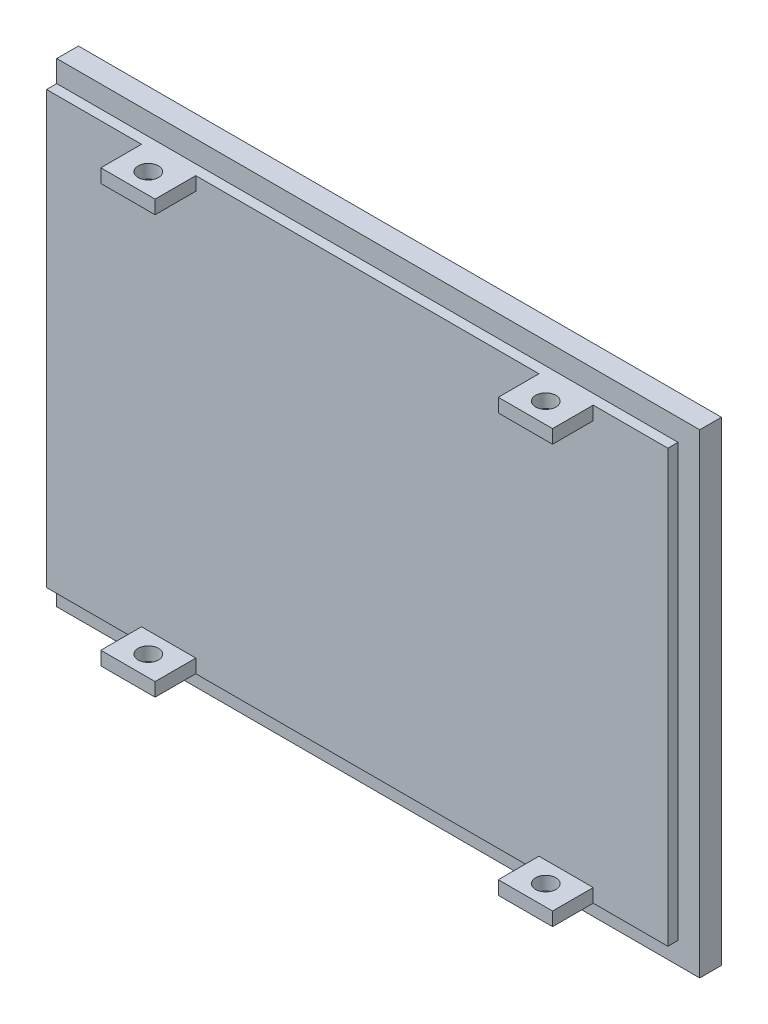
ISO-10303-21;
HEADER;
FILE_DESCRIPTION(('STEP AP214'),'2;1');
FILE_NAME('part.step','',(''),(''),'','','');
FILE_SCHEMA(('AUTOMOTIVE_DESIGN { 1 0 10303 214 1 1 1 1 }'));
ENDSEC;
DATA;
#1=APPLICATION_CONTEXT('core data for automotive mechanical design processes');
#2=APPLICATION_PROTOCOL_DEFINITION('international standard','automotive_design',2000,#1);
#3=PRODUCT_CONTEXT('',#1,'mechanical');
#4=PRODUCT('Part','Part','',(#3));
#5=PRODUCT_RELATED_PRODUCT_CATEGORY('part','',(#4));
#6=PRODUCT_DEFINITION_FORMATION('','',#4);
#7=PRODUCT_DEFINITION_CONTEXT('part definition',#1,'design');
#8=PRODUCT_DEFINITION('design','',#6,#7);
#9=PRODUCT_DEFINITION_SHAPE('','',#8);
#10=(LENGTH_UNIT() NAMED_UNIT(*) SI_UNIT(.MILLI.,.METRE.));
#11=(NAMED_UNIT(*) PLANE_ANGLE_UNIT() SI_UNIT($,.RADIAN.));
#12=(NAMED_UNIT(*) SI_UNIT($,.STERADIAN.) SOLID_ANGLE_UNIT());
#13=UNCERTAINTY_MEASURE_WITH_UNIT(LENGTH_MEASURE(1.E-05),#10,'distance_accuracy_value','');
#14=(GEOMETRIC_REPRESENTATION_CONTEXT(3) GLOBAL_UNCERTAINTY_ASSIGNED_CONTEXT((#13)) GLOBAL_UNIT_ASSIGNED_CONTEXT((#10,
#11,#12)) REPRESENTATION_CONTEXT('',''));
#15=CARTESIAN_POINT('',(0.,0.,0.));
#16=DIRECTION('',(0.,0.,1.));
#17=DIRECTION('',(1.,0.,0.));
#18=AXIS2_PLACEMENT_3D('',#15,#16,#17);
#19=CARTESIAN_POINT('',(0.,0.,3.2));
#20=DIRECTION('',(0.,0.,1.));
#21=DIRECTION('',(1.,0.,0.));
#22=AXIS2_PLACEMENT_3D('',#19,#20,#21);
#23=PLANE('',#22);
#24=DIRECTION('',(0.,-1.,0.));
#25=VECTOR('',#24,1.);
#26=CARTESIAN_POINT('',(-47.3,35.,3.2));
#27=LINE('',#26,#25);
#28=CARTESIAN_POINT('',(-47.3,35.,3.2));
#29=VERTEX_POINT('',#28);
#30=CARTESIAN_POINT('',(-47.3,31.8,3.2));
#31=VERTEX_POINT('',#30);
#32=EDGE_CURVE('E386',#29,#31,#27,.T.);
#33=ORIENTED_EDGE('',*,*,#32,.T.);
#34=DIRECTION('',(-1.,0.,0.));
#35=VECTOR('',#34,1.);
#36=CARTESIAN_POINT('',(44.3,31.8,3.2));
#37=LINE('',#36,#35);
#38=CARTESIAN_POINT('',(44.3,31.8,3.2));
#39=VERTEX_POINT('',#38);
#40=EDGE_CURVE('E66',#39,#31,#37,.T.);
#41=ORIENTED_EDGE('',*,*,#40,.F.);
#42=DIRECTION('',(0.,1.,0.));
#43=VECTOR('',#42,1.);
#44=CARTESIAN_POINT('',(44.3,-31.8,3.2));
#45=LINE('',#44,#43);
#46=CARTESIAN_POINT('',(44.3,-31.8,3.2));
#47=VERTEX_POINT('',#46);
#48=EDGE_CURVE('E370',#47,#39,#45,.T.);
#49=ORIENTED_EDGE('',*,*,#48,.F.);
#50=DIRECTION('',(1.,0.,0.));
#51=VECTOR('',#50,1.);
#52=CARTESIAN_POINT('',(44.3,-31.8,3.2));
#53=LINE('',#52,#51);
#54=CARTESIAN_POINT('',(-47.3,-31.8,3.2));
#55=VERTEX_POINT('',#54);
#56=EDGE_CURVE('E58',#55,#47,#53,.T.);
#57=ORIENTED_EDGE('',*,*,#56,.F.);
#58=CARTESIAN_POINT('',(-47.3,-35.,3.2));
#59=VERTEX_POINT('',#58);
#60=EDGE_CURVE('E385',#55,#59,#27,.T.);
#61=ORIENTED_EDGE('',*,*,#60,.T.);
#62=DIRECTION('',(1.,0.,0.));
#63=VECTOR('',#62,1.);
#64=CARTESIAN_POINT('',(-47.3,-35.,3.2));
#65=LINE('',#64,#63);
#66=CARTESIAN_POINT('',(47.5,-35.,3.2));
#67=VERTEX_POINT('',#66);
#68=EDGE_CURVE('E388',#59,#67,#65,.T.);
#69=ORIENTED_EDGE('',*,*,#68,.T.);
#70=DIRECTION('',(0.,1.,0.));
#71=VECTOR('',#70,1.);
#72=CARTESIAN_POINT('',(47.5,35.,3.2));
#73=LINE('',#72,#71);
#74=CARTESIAN_POINT('',(47.5,35.,3.2));
#75=VERTEX_POINT('',#74);
#76=EDGE_CURVE('E379',#67,#75,#73,.T.);
#77=ORIENTED_EDGE('',*,*,#76,.T.);
#78=DIRECTION('',(-1.,0.,0.));
#79=VECTOR('',#78,1.);
#80=CARTESIAN_POINT('',(-47.3,35.,3.2));
#81=LINE('',#80,#79);
#82=EDGE_CURVE('E382',#75,#29,#81,.T.);
#83=ORIENTED_EDGE('',*,*,#82,.T.);
#84=EDGE_LOOP('',(#33,#41,#49,#57,#61,#69,#77,#83));
#85=FACE_BOUND('',#84,.T.);
#86=ADVANCED_FACE('F41',(#85),#23,.T.);
#87=CARTESIAN_POINT('',(0.,0.,4.7));
#88=DIRECTION('',(0.,0.,1.));
#89=DIRECTION('',(1.,0.,0.));
#90=AXIS2_PLACEMENT_3D('',#87,#88,#89);
#91=PLANE('',#90);
#92=DIRECTION('',(1.,0.,0.));
#93=VECTOR('',#92,1.);
#94=CARTESIAN_POINT('',(-33.3,29.8,4.7));
#95=LINE('',#94,#93);
#96=CARTESIAN_POINT('',(-33.3,29.8,4.7));
#97=VERTEX_POINT('',#96);
#98=CARTESIAN_POINT('',(-25.3,29.8,4.7));
#99=VERTEX_POINT('',#98);
#100=EDGE_CURVE('E264',#97,#99,#95,.T.);
#101=ORIENTED_EDGE('',*,*,#100,.F.);
#102=DIRECTION('',(0.,-1.,0.));
#103=VECTOR('',#102,1.);
#104=CARTESIAN_POINT('',(-33.3,29.8,4.7));
#105=LINE('',#104,#103);
#106=CARTESIAN_POINT('',(-33.3,31.8,4.7));
#107=VERTEX_POINT('',#106);
#108=EDGE_CURVE('E211',#107,#97,#105,.T.);
#109=ORIENTED_EDGE('',*,*,#108,.F.);
#110=DIRECTION('',(-1.,0.,0.));
#111=VECTOR('',#110,1.);
#112=CARTESIAN_POINT('',(44.3,31.8,4.7));
#113=LINE('',#112,#111);
#114=CARTESIAN_POINT('',(-47.3,31.8,4.7));
#115=VERTEX_POINT('',#114);
#116=EDGE_CURVE('E205',#107,#115,#113,.T.);
#117=ORIENTED_EDGE('',*,*,#116,.T.);
#118=DIRECTION('',(0.,-1.,0.));
#119=VECTOR('',#118,1.);
#120=CARTESIAN_POINT('',(-47.3,-31.8,4.7));
#121=LINE('',#120,#119);
#122=CARTESIAN_POINT('',(-47.3,-31.8,4.7));
#123=VERTEX_POINT('',#122);
#124=EDGE_CURVE('E208',#115,#123,#121,.T.);
#125=ORIENTED_EDGE('',*,*,#124,.T.);
#126=DIRECTION('',(1.,0.,0.));
#127=VECTOR('',#126,1.);
#128=CARTESIAN_POINT('',(44.3,-31.8,4.7));
#129=LINE('',#128,#127);
#130=CARTESIAN_POINT('',(-33.3,-31.8,4.7));
#131=VERTEX_POINT('',#130);
#132=EDGE_CURVE('E363',#123,#131,#129,.T.);
#133=ORIENTED_EDGE('',*,*,#132,.T.);
#134=DIRECTION('',(0.,-1.,0.));
#135=VECTOR('',#134,1.);
#136=CARTESIAN_POINT('',(-33.3,-29.8,4.7));
#137=LINE('',#136,#135);
#138=CARTESIAN_POINT('',(-33.3,-29.8,4.7));
#139=VERTEX_POINT('',#138);
#140=EDGE_CURVE('E296',#139,#131,#137,.T.);
#141=ORIENTED_EDGE('',*,*,#140,.F.);
#142=DIRECTION('',(-1.,0.,0.));
#143=VECTOR('',#142,1.);
#144=CARTESIAN_POINT('',(-33.3,-29.8,4.7));
#145=LINE('',#144,#143);
#146=CARTESIAN_POINT('',(-25.3,-29.8,4.7));
#147=VERTEX_POINT('',#146);
#148=EDGE_CURVE('E289',#147,#139,#145,.T.);
#149=ORIENTED_EDGE('',*,*,#148,.F.);
#150=DIRECTION('',(0.,1.,0.));
#151=VECTOR('',#150,1.);
#152=CARTESIAN_POINT('',(-25.3,-29.8,4.7));
#153=LINE('',#152,#151);
#154=CARTESIAN_POINT('',(-25.3,-31.8,4.7));
#155=VERTEX_POINT('',#154);
#156=EDGE_CURVE('E292',#155,#147,#153,.T.);
#157=ORIENTED_EDGE('',*,*,#156,.F.);
#158=CARTESIAN_POINT('',(25.3,-31.8,4.7));
#159=VERTEX_POINT('',#158);
#160=EDGE_CURVE('E365',#155,#159,#129,.T.);
#161=ORIENTED_EDGE('',*,*,#160,.T.);
#162=DIRECTION('',(0.,-1.,0.));
#163=VECTOR('',#162,1.);
#164=CARTESIAN_POINT('',(25.3,-29.8,4.7));
#165=LINE('',#164,#163);
#166=CARTESIAN_POINT('',(25.3,-29.8,4.7));
#167=VERTEX_POINT('',#166);
#168=EDGE_CURVE('E319',#167,#159,#165,.T.);
#169=ORIENTED_EDGE('',*,*,#168,.F.);
#170=DIRECTION('',(-1.,0.,0.));
#171=VECTOR('',#170,1.);
#172=CARTESIAN_POINT('',(33.3,-29.8,4.7));
#173=LINE('',#172,#171);
#174=CARTESIAN_POINT('',(33.3,-29.8,4.7));
#175=VERTEX_POINT('',#174);
#176=EDGE_CURVE('E323',#175,#167,#173,.T.);
#177=ORIENTED_EDGE('',*,*,#176,.F.);
#178=DIRECTION('',(0.,1.,0.));
#179=VECTOR('',#178,1.);
#180=CARTESIAN_POINT('',(33.3,-29.8,4.7));
#181=LINE('',#180,#179);
#182=CARTESIAN_POINT('',(33.3,-31.8,4.7));
#183=VERTEX_POINT('',#182);
#184=EDGE_CURVE('E317',#183,#175,#181,.T.);
#185=ORIENTED_EDGE('',*,*,#184,.F.);
#186=CARTESIAN_POINT('',(44.3,-31.8,4.7));
#187=VERTEX_POINT('',#186);
#188=EDGE_CURVE('E366',#183,#187,#129,.T.);
#189=ORIENTED_EDGE('',*,*,#188,.T.);
#190=DIRECTION('',(0.,1.,0.));
#191=VECTOR('',#190,1.);
#192=CARTESIAN_POINT('',(44.3,-31.8,4.7));
#193=LINE('',#192,#191);
#194=CARTESIAN_POINT('',(44.3,31.8,4.7));
#195=VERTEX_POINT('',#194);
#196=EDGE_CURVE('E215',#187,#195,#193,.T.);
#197=ORIENTED_EDGE('',*,*,#196,.T.);
#198=CARTESIAN_POINT('',(33.3,31.8,4.7));
#199=VERTEX_POINT('',#198);
#200=EDGE_CURVE('E217',#195,#199,#113,.T.);
#201=ORIENTED_EDGE('',*,*,#200,.T.);
#202=DIRECTION('',(0.,1.,0.));
#203=VECTOR('',#202,1.);
#204=CARTESIAN_POINT('',(33.3,29.8,4.7));
#205=LINE('',#204,#203);
#206=CARTESIAN_POINT('',(33.3,29.8,4.7));
#207=VERTEX_POINT('',#206);
#208=EDGE_CURVE('E338',#207,#199,#205,.T.);
#209=ORIENTED_EDGE('',*,*,#208,.F.);
#210=DIRECTION('',(1.,0.,0.));
#211=VECTOR('',#210,1.);
#212=CARTESIAN_POINT('',(33.3,29.8,4.7));
#213=LINE('',#212,#211);
#214=CARTESIAN_POINT('',(25.3,29.8,4.7));
#215=VERTEX_POINT('',#214);
#216=EDGE_CURVE('E347',#215,#207,#213,.T.);
#217=ORIENTED_EDGE('',*,*,#216,.F.);
#218=DIRECTION('',(0.,-1.,0.));
#219=VECTOR('',#218,1.);
#220=CARTESIAN_POINT('',(25.3,29.8,4.7));
#221=LINE('',#220,#219);
#222=CARTESIAN_POINT('',(25.3,31.8,4.7));
#223=VERTEX_POINT('',#222);
#224=EDGE_CURVE('E326',#223,#215,#221,.T.);
#225=ORIENTED_EDGE('',*,*,#224,.F.);
#226=CARTESIAN_POINT('',(-25.3,31.8,4.7));
#227=VERTEX_POINT('',#226);
#228=EDGE_CURVE('E214',#223,#227,#113,.T.);
#229=ORIENTED_EDGE('',*,*,#228,.T.);
#230=DIRECTION('',(0.,1.,0.));
#231=VECTOR('',#230,1.);
#232=CARTESIAN_POINT('',(-25.3,29.8,4.7));
#233=LINE('',#232,#231);
#234=EDGE_CURVE('E261',#99,#227,#233,.T.);
#235=ORIENTED_EDGE('',*,*,#234,.F.);
#236=EDGE_LOOP('',(#101,#109,#117,#125,#133,#141,#149,#157,#161,#169,#177,#185,#189,#197,#201,
#209,#217,#225,#229,#235));
#237=FACE_BOUND('',#236,.T.);
#238=ADVANCED_FACE('F207',(#237),#91,.T.);
#239=CARTESIAN_POINT('',(47.5,35.,3.2));
#240=DIRECTION('',(-1.,0.,0.));
#241=DIRECTION('',(0.,0.,1.));
#242=AXIS2_PLACEMENT_3D('',#239,#240,#241);
#243=PLANE('',#242);
#244=DIRECTION('',(0.,1.,0.));
#245=VECTOR('',#244,1.);
#246=CARTESIAN_POINT('',(47.5,35.,0.));
#247=LINE('',#246,#245);
#248=CARTESIAN_POINT('',(47.5,-35.,0.));
#249=VERTEX_POINT('',#248);
#250=CARTESIAN_POINT('',(47.5,35.,0.));
#251=VERTEX_POINT('',#250);
#252=EDGE_CURVE('E378',#249,#251,#247,.T.);
#253=ORIENTED_EDGE('',*,*,#252,.T.);
#254=DIRECTION('',(0.,0.,-1.));
#255=VECTOR('',#254,1.);
#256=CARTESIAN_POINT('',(47.5,35.,3.2));
#257=LINE('',#256,#255);
#258=EDGE_CURVE('E11',#75,#251,#257,.T.);
#259=ORIENTED_EDGE('',*,*,#258,.F.);
#260=ORIENTED_EDGE('',*,*,#76,.F.);
#261=DIRECTION('',(0.,0.,-1.));
#262=VECTOR('',#261,1.);
#263=CARTESIAN_POINT('',(47.5,-35.,3.2));
#264=LINE('',#263,#262);
#265=EDGE_CURVE('E390',#67,#249,#264,.T.);
#266=ORIENTED_EDGE('',*,*,#265,.T.);
#267=EDGE_LOOP('',(#253,#259,#260,#266));
#268=FACE_BOUND('',#267,.T.);
#269=ADVANCED_FACE('F43',(#268),#243,.F.);
#270=CARTESIAN_POINT('',(-47.3,35.,3.2));
#271=DIRECTION('',(0.,-1.,0.));
#272=DIRECTION('',(0.,0.,-1.));
#273=AXIS2_PLACEMENT_3D('',#270,#271,#272);
#274=PLANE('',#273);
#275=DIRECTION('',(-1.,0.,0.));
#276=VECTOR('',#275,1.);
#277=CARTESIAN_POINT('',(-47.3,35.,0.));
#278=LINE('',#277,#276);
#279=CARTESIAN_POINT('',(-47.3,35.,0.));
#280=VERTEX_POINT('',#279);
#281=EDGE_CURVE('E393',#251,#280,#278,.T.);
#282=ORIENTED_EDGE('',*,*,#281,.T.);
#283=DIRECTION('',(0.,0.,-1.));
#284=VECTOR('',#283,1.);
#285=CARTESIAN_POINT('',(-47.3,35.,3.2));
#286=LINE('',#285,#284);
#287=EDGE_CURVE('E50',#29,#280,#286,.T.);
#288=ORIENTED_EDGE('',*,*,#287,.F.);
#289=ORIENTED_EDGE('',*,*,#82,.F.);
#290=ORIENTED_EDGE('',*,*,#258,.T.);
#291=EDGE_LOOP('',(#282,#288,#289,#290));
#292=FACE_BOUND('',#291,.T.);
#293=ADVANCED_FACE('F448',(#292),#274,.F.);
#294=CARTESIAN_POINT('',(-47.3,35.,3.2));
#295=DIRECTION('',(1.,0.,0.));
#296=DIRECTION('',(0.,1.,0.));
#297=AXIS2_PLACEMENT_3D('',#294,#295,#296);
#298=PLANE('',#297);
#299=DIRECTION('',(0.,-1.,0.));
#300=VECTOR('',#299,1.);
#301=CARTESIAN_POINT('',(-47.3,35.,0.));
#302=LINE('',#301,#300);
#303=CARTESIAN_POINT('',(-47.3,-35.,0.));
#304=VERTEX_POINT('',#303);
#305=EDGE_CURVE('E395',#280,#304,#302,.T.);
#306=ORIENTED_EDGE('',*,*,#305,.T.);
#307=DIRECTION('',(0.,0.,-1.));
#308=VECTOR('',#307,1.);
#309=CARTESIAN_POINT('',(-47.3,-35.,3.2));
#310=LINE('',#309,#308);
#311=EDGE_CURVE('E400',#59,#304,#310,.T.);
#312=ORIENTED_EDGE('',*,*,#311,.F.);
#313=ORIENTED_EDGE('',*,*,#60,.F.);
#314=DIRECTION('',(0.,0.,-1.));
#315=VECTOR('',#314,1.);
#316=CARTESIAN_POINT('',(-47.3,-31.8,4.7));
#317=LINE('',#316,#315);
#318=EDGE_CURVE('E224',#123,#55,#317,.T.);
#319=ORIENTED_EDGE('',*,*,#318,.F.);
#320=ORIENTED_EDGE('',*,*,#124,.F.);
#321=DIRECTION('',(0.,0.,-1.));
#322=VECTOR('',#321,1.);
#323=CARTESIAN_POINT('',(-47.3,31.8,4.7));
#324=LINE('',#323,#322);
#325=EDGE_CURVE('E222',#115,#31,#324,.T.);
#326=ORIENTED_EDGE('',*,*,#325,.T.);
#327=ORIENTED_EDGE('',*,*,#32,.F.);
#328=ORIENTED_EDGE('',*,*,#287,.T.);
#329=EDGE_LOOP('',(#306,#312,#313,#319,#320,#326,#327,#328));
#330=FACE_BOUND('',#329,.T.);
#331=ADVANCED_FACE('F220',(#330),#298,.F.);
#332=CARTESIAN_POINT('',(-47.3,-35.,3.2));
#333=DIRECTION('',(0.,1.,0.));
#334=DIRECTION('',(0.,0.,1.));
#335=AXIS2_PLACEMENT_3D('',#332,#333,#334);
#336=PLANE('',#335);
#337=DIRECTION('',(1.,0.,0.));
#338=VECTOR('',#337,1.);
#339=CARTESIAN_POINT('',(-47.3,-35.,0.));
#340=LINE('',#339,#338);
#341=EDGE_CURVE('E383',#304,#249,#340,.T.);
#342=ORIENTED_EDGE('',*,*,#341,.T.);
#343=ORIENTED_EDGE('',*,*,#265,.F.);
#344=ORIENTED_EDGE('',*,*,#68,.F.);
#345=ORIENTED_EDGE('',*,*,#311,.T.);
#346=EDGE_LOOP('',(#342,#343,#344,#345));
#347=FACE_BOUND('',#346,.T.);
#348=ADVANCED_FACE('F442',(#347),#336,.F.);
#349=CARTESIAN_POINT('',(0.,0.,0.));
#350=DIRECTION('',(0.,0.,1.));
#351=DIRECTION('',(1.,0.,0.));
#352=AXIS2_PLACEMENT_3D('',#349,#350,#351);
#353=PLANE('',#352);
#354=ORIENTED_EDGE('',*,*,#252,.F.);
#355=ORIENTED_EDGE('',*,*,#341,.F.);
#356=ORIENTED_EDGE('',*,*,#305,.F.);
#357=ORIENTED_EDGE('',*,*,#281,.F.);
#358=EDGE_LOOP('',(#354,#355,#356,#357));
#359=FACE_BOUND('',#358,.T.);
#360=ADVANCED_FACE('F439',(#359),#353,.F.);
#361=CARTESIAN_POINT('',(44.3,-31.8,4.7));
#362=DIRECTION('',(0.,1.,0.));
#363=DIRECTION('',(-1.,0.,0.));
#364=AXIS2_PLACEMENT_3D('',#361,#362,#363);
#365=PLANE('',#364);
#366=CARTESIAN_POINT('',(29.3,-31.8,7.7));
#367=DIRECTION('',(0.,1.,0.));
#368=DIRECTION('',(-1.,0.,0.));
#369=AXIS2_PLACEMENT_3D('',#366,#367,#368);
#370=CIRCLE('',#369,1.5);
#371=CARTESIAN_POINT('',(27.8,-31.8,7.7));
#372=VERTEX_POINT('',#371);
#373=EDGE_CURVE('E246',#372,#372,#370,.T.);
#374=ORIENTED_EDGE('',*,*,#373,.T.);
#375=EDGE_LOOP('',(#374));
#376=FACE_BOUND('',#375,.T.);
#377=CARTESIAN_POINT('',(-29.3,-31.8,7.7));
#378=DIRECTION('',(0.,1.,0.));
#379=DIRECTION('',(-1.,0.,0.));
#380=AXIS2_PLACEMENT_3D('',#377,#378,#379);
#381=CIRCLE('',#380,1.5);
#382=CARTESIAN_POINT('',(-30.8,-31.8,7.7));
#383=VERTEX_POINT('',#382);
#384=EDGE_CURVE('E240',#383,#383,#381,.T.);
#385=ORIENTED_EDGE('',*,*,#384,.T.);
#386=EDGE_LOOP('',(#385));
#387=FACE_BOUND('',#386,.T.);
#388=ORIENTED_EDGE('',*,*,#56,.T.);
#389=DIRECTION('',(0.,0.,-1.));
#390=VECTOR('',#389,1.);
#391=CARTESIAN_POINT('',(44.3,-31.8,4.7));
#392=LINE('',#391,#390);
#393=EDGE_CURVE('E375',#187,#47,#392,.T.);
#394=ORIENTED_EDGE('',*,*,#393,.F.);
#395=ORIENTED_EDGE('',*,*,#188,.F.);
#396=DIRECTION('',(0.,0.,-1.));
#397=VECTOR('',#396,1.);
#398=CARTESIAN_POINT('',(33.3,-31.8,10.7));
#399=LINE('',#398,#397);
#400=CARTESIAN_POINT('',(33.3,-31.8,10.7));
#401=VERTEX_POINT('',#400);
#402=EDGE_CURVE('E311',#401,#183,#399,.T.);
#403=ORIENTED_EDGE('',*,*,#402,.F.);
#404=DIRECTION('',(1.,0.,0.));
#405=VECTOR('',#404,1.);
#406=CARTESIAN_POINT('',(33.3,-31.8,10.7));
#407=LINE('',#406,#405);
#408=CARTESIAN_POINT('',(25.3,-31.8,10.7));
#409=VERTEX_POINT('',#408);
#410=EDGE_CURVE('E328',#409,#401,#407,.T.);
#411=ORIENTED_EDGE('',*,*,#410,.F.);
#412=DIRECTION('',(0.,0.,-1.));
#413=VECTOR('',#412,1.);
#414=CARTESIAN_POINT('',(25.3,-31.8,10.7));
#415=LINE('',#414,#413);
#416=EDGE_CURVE('E308',#409,#159,#415,.T.);
#417=ORIENTED_EDGE('',*,*,#416,.T.);
#418=ORIENTED_EDGE('',*,*,#160,.F.);
#419=DIRECTION('',(0.,0.,-1.));
#420=VECTOR('',#419,1.);
#421=CARTESIAN_POINT('',(-25.3,-31.8,10.7));
#422=LINE('',#421,#420);
#423=CARTESIAN_POINT('',(-25.3,-31.8,10.7));
#424=VERTEX_POINT('',#423);
#425=EDGE_CURVE('E279',#424,#155,#422,.T.);
#426=ORIENTED_EDGE('',*,*,#425,.F.);
#427=DIRECTION('',(1.,0.,0.));
#428=VECTOR('',#427,1.);
#429=CARTESIAN_POINT('',(-33.3,-31.8,10.7));
#430=LINE('',#429,#428);
#431=CARTESIAN_POINT('',(-33.3,-31.8,10.7));
#432=VERTEX_POINT('',#431);
#433=EDGE_CURVE('E303',#432,#424,#430,.T.);
#434=ORIENTED_EDGE('',*,*,#433,.F.);
#435=DIRECTION('',(0.,0.,-1.));
#436=VECTOR('',#435,1.);
#437=CARTESIAN_POINT('',(-33.3,-31.8,10.7));
#438=LINE('',#437,#436);
#439=EDGE_CURVE('E269',#432,#131,#438,.T.);
#440=ORIENTED_EDGE('',*,*,#439,.T.);
#441=ORIENTED_EDGE('',*,*,#132,.F.);
#442=ORIENTED_EDGE('',*,*,#318,.T.);
#443=EDGE_LOOP('',(#388,#394,#395,#403,#411,#417,#418,#426,#434,#440,#441,#442));
#444=FACE_BOUND('',#443,.T.);
#445=ADVANCED_FACE('F437',(#376,#387,#444),#365,.F.);
#446=CARTESIAN_POINT('',(44.3,-31.8,4.7));
#447=DIRECTION('',(-1.,0.,0.));
#448=DIRECTION('',(0.,0.,1.));
#449=AXIS2_PLACEMENT_3D('',#446,#447,#448);
#450=PLANE('',#449);
#451=ORIENTED_EDGE('',*,*,#48,.T.);
#452=DIRECTION('',(0.,0.,-1.));
#453=VECTOR('',#452,1.);
#454=CARTESIAN_POINT('',(44.3,31.8,4.7));
#455=LINE('',#454,#453);
#456=EDGE_CURVE('E368',#195,#39,#455,.T.);
#457=ORIENTED_EDGE('',*,*,#456,.F.);
#458=ORIENTED_EDGE('',*,*,#196,.F.);
#459=ORIENTED_EDGE('',*,*,#393,.T.);
#460=EDGE_LOOP('',(#451,#457,#458,#459));
#461=FACE_BOUND('',#460,.T.);
#462=ADVANCED_FACE('F503',(#461),#450,.F.);
#463=CARTESIAN_POINT('',(44.3,31.8,4.7));
#464=DIRECTION('',(0.,-1.,0.));
#465=DIRECTION('',(1.,0.,0.));
#466=AXIS2_PLACEMENT_3D('',#463,#464,#465);
#467=PLANE('',#466);
#468=CARTESIAN_POINT('',(29.3,31.8,7.7));
#469=DIRECTION('',(0.,1.,0.));
#470=DIRECTION('',(-1.,0.,0.));
#471=AXIS2_PLACEMENT_3D('',#468,#469,#470);
#472=CIRCLE('',#471,1.5);
#473=CARTESIAN_POINT('',(27.8,31.8,7.7));
#474=VERTEX_POINT('',#473);
#475=EDGE_CURVE('E230',#474,#474,#472,.T.);
#476=ORIENTED_EDGE('',*,*,#475,.F.);
#477=EDGE_LOOP('',(#476));
#478=FACE_BOUND('',#477,.T.);
#479=CARTESIAN_POINT('',(-29.3,31.8,7.7));
#480=DIRECTION('',(0.,1.,0.));
#481=DIRECTION('',(-1.,0.,0.));
#482=AXIS2_PLACEMENT_3D('',#479,#480,#481);
#483=CIRCLE('',#482,1.5);
#484=CARTESIAN_POINT('',(-30.8,31.8,7.7));
#485=VERTEX_POINT('',#484);
#486=EDGE_CURVE('E227',#485,#485,#483,.T.);
#487=ORIENTED_EDGE('',*,*,#486,.F.);
#488=EDGE_LOOP('',(#487));
#489=FACE_BOUND('',#488,.T.);
#490=ORIENTED_EDGE('',*,*,#40,.T.);
#491=ORIENTED_EDGE('',*,*,#325,.F.);
#492=ORIENTED_EDGE('',*,*,#116,.F.);
#493=DIRECTION('',(0.,0.,-1.));
#494=VECTOR('',#493,1.);
#495=CARTESIAN_POINT('',(-33.3,31.8,10.7));
#496=LINE('',#495,#494);
#497=CARTESIAN_POINT('',(-33.3,31.8,10.7));
#498=VERTEX_POINT('',#497);
#499=EDGE_CURVE('E258',#498,#107,#496,.T.);
#500=ORIENTED_EDGE('',*,*,#499,.F.);
#501=DIRECTION('',(-1.,0.,0.));
#502=VECTOR('',#501,1.);
#503=CARTESIAN_POINT('',(-33.3,31.8,10.7));
#504=LINE('',#503,#502);
#505=CARTESIAN_POINT('',(-25.3,31.8,10.7));
#506=VERTEX_POINT('',#505);
#507=EDGE_CURVE('E260',#506,#498,#504,.T.);
#508=ORIENTED_EDGE('',*,*,#507,.F.);
#509=DIRECTION('',(0.,0.,-1.));
#510=VECTOR('',#509,1.);
#511=CARTESIAN_POINT('',(-25.3,31.8,10.7));
#512=LINE('',#511,#510);
#513=EDGE_CURVE('E255',#506,#227,#512,.T.);
#514=ORIENTED_EDGE('',*,*,#513,.T.);
#515=ORIENTED_EDGE('',*,*,#228,.F.);
#516=DIRECTION('',(0.,0.,-1.));
#517=VECTOR('',#516,1.);
#518=CARTESIAN_POINT('',(25.3,31.8,10.7));
#519=LINE('',#518,#517);
#520=CARTESIAN_POINT('',(25.3,31.8,10.7));
#521=VERTEX_POINT('',#520);
#522=EDGE_CURVE('E344',#521,#223,#519,.T.);
#523=ORIENTED_EDGE('',*,*,#522,.F.);
#524=DIRECTION('',(-1.,0.,0.));
#525=VECTOR('',#524,1.);
#526=CARTESIAN_POINT('',(33.3,31.8,10.7));
#527=LINE('',#526,#525);
#528=CARTESIAN_POINT('',(33.3,31.8,10.7));
#529=VERTEX_POINT('',#528);
#530=EDGE_CURVE('E342',#529,#521,#527,.T.);
#531=ORIENTED_EDGE('',*,*,#530,.F.);
#532=DIRECTION('',(0.,0.,-1.));
#533=VECTOR('',#532,1.);
#534=CARTESIAN_POINT('',(33.3,31.8,10.7));
#535=LINE('',#534,#533);
#536=EDGE_CURVE('E354',#529,#199,#535,.T.);
#537=ORIENTED_EDGE('',*,*,#536,.T.);
#538=ORIENTED_EDGE('',*,*,#200,.F.);
#539=ORIENTED_EDGE('',*,*,#456,.T.);
#540=EDGE_LOOP('',(#490,#491,#492,#500,#508,#514,#515,#523,#531,#537,#538,#539));
#541=FACE_BOUND('',#540,.T.);
#542=ADVANCED_FACE('F226',(#478,#489,#541),#467,.F.);
#543=CARTESIAN_POINT('',(25.3,29.8,10.7));
#544=DIRECTION('',(1.,0.,0.));
#545=DIRECTION('',(0.,0.,-1.));
#546=AXIS2_PLACEMENT_3D('',#543,#544,#545);
#547=PLANE('',#546);
#548=ORIENTED_EDGE('',*,*,#224,.T.);
#549=DIRECTION('',(0.,0.,-1.));
#550=VECTOR('',#549,1.);
#551=CARTESIAN_POINT('',(25.3,29.8,10.7));
#552=LINE('',#551,#550);
#553=CARTESIAN_POINT('',(25.3,29.8,10.7));
#554=VERTEX_POINT('',#553);
#555=EDGE_CURVE('E360',#554,#215,#552,.T.);
#556=ORIENTED_EDGE('',*,*,#555,.F.);
#557=DIRECTION('',(0.,-1.,0.));
#558=VECTOR('',#557,1.);
#559=CARTESIAN_POINT('',(25.3,29.8,10.7));
#560=LINE('',#559,#558);
#561=EDGE_CURVE('E334',#521,#554,#560,.T.);
#562=ORIENTED_EDGE('',*,*,#561,.F.);
#563=ORIENTED_EDGE('',*,*,#522,.T.);
#564=EDGE_LOOP('',(#548,#556,#562,#563));
#565=FACE_BOUND('',#564,.T.);
#566=ADVANCED_FACE('F522',(#565),#547,.F.);
#567=CARTESIAN_POINT('',(33.3,29.8,10.7));
#568=DIRECTION('',(0.,1.,0.));
#569=DIRECTION('',(0.,0.,1.));
#570=AXIS2_PLACEMENT_3D('',#567,#568,#569);
#571=PLANE('',#570);
#572=CARTESIAN_POINT('',(29.3,29.8,7.7));
#573=DIRECTION('',(0.,1.,0.));
#574=DIRECTION('',(0.,0.,1.));
#575=AXIS2_PLACEMENT_3D('',#572,#573,#574);
#576=CIRCLE('',#575,1.5);
#577=CARTESIAN_POINT('',(29.3,29.8,9.2));
#578=VERTEX_POINT('',#577);
#579=EDGE_CURVE('E243',#578,#578,#576,.T.);
#580=ORIENTED_EDGE('',*,*,#579,.T.);
#581=EDGE_LOOP('',(#580));
#582=FACE_BOUND('',#581,.T.);
#583=ORIENTED_EDGE('',*,*,#216,.T.);
#584=DIRECTION('',(0.,0.,-1.));
#585=VECTOR('',#584,1.);
#586=CARTESIAN_POINT('',(33.3,29.8,10.7));
#587=LINE('',#586,#585);
#588=CARTESIAN_POINT('',(33.3,29.8,10.7));
#589=VERTEX_POINT('',#588);
#590=EDGE_CURVE('E357',#589,#207,#587,.T.);
#591=ORIENTED_EDGE('',*,*,#590,.F.);
#592=DIRECTION('',(1.,0.,0.));
#593=VECTOR('',#592,1.);
#594=CARTESIAN_POINT('',(33.3,29.8,10.7));
#595=LINE('',#594,#593);
#596=EDGE_CURVE('E337',#554,#589,#595,.T.);
#597=ORIENTED_EDGE('',*,*,#596,.F.);
#598=ORIENTED_EDGE('',*,*,#555,.T.);
#599=EDGE_LOOP('',(#583,#591,#597,#598));
#600=FACE_BOUND('',#599,.T.);
#601=ADVANCED_FACE('F518',(#582,#600),#571,.F.);
#602=CARTESIAN_POINT('',(33.3,29.8,10.7));
#603=DIRECTION('',(-1.,0.,0.));
#604=DIRECTION('',(0.,0.,1.));
#605=AXIS2_PLACEMENT_3D('',#602,#603,#604);
#606=PLANE('',#605);
#607=ORIENTED_EDGE('',*,*,#208,.T.);
#608=ORIENTED_EDGE('',*,*,#536,.F.);
#609=DIRECTION('',(0.,1.,0.));
#610=VECTOR('',#609,1.);
#611=CARTESIAN_POINT('',(33.3,29.8,10.7));
#612=LINE('',#611,#610);
#613=EDGE_CURVE('E340',#589,#529,#612,.T.);
#614=ORIENTED_EDGE('',*,*,#613,.F.);
#615=ORIENTED_EDGE('',*,*,#590,.T.);
#616=EDGE_LOOP('',(#607,#608,#614,#615));
#617=FACE_BOUND('',#616,.T.);
#618=ADVANCED_FACE('F507',(#617),#606,.F.);
#619=CARTESIAN_POINT('',(0.,0.,10.7));
#620=DIRECTION('',(0.,0.,1.));
#621=DIRECTION('',(1.,0.,0.));
#622=AXIS2_PLACEMENT_3D('',#619,#620,#621);
#623=PLANE('',#622);
#624=ORIENTED_EDGE('',*,*,#561,.T.);
#625=ORIENTED_EDGE('',*,*,#596,.T.);
#626=ORIENTED_EDGE('',*,*,#613,.T.);
#627=ORIENTED_EDGE('',*,*,#530,.T.);
#628=EDGE_LOOP('',(#624,#625,#626,#627));
#629=FACE_BOUND('',#628,.T.);
#630=ADVANCED_FACE('F515',(#629),#623,.T.);
#631=CARTESIAN_POINT('',(33.3,-29.8,10.7));
#632=DIRECTION('',(0.,-1.,0.));
#633=DIRECTION('',(0.,0.,-1.));
#634=AXIS2_PLACEMENT_3D('',#631,#632,#633);
#635=PLANE('',#634);
#636=CARTESIAN_POINT('',(29.3,-29.8,7.7));
#637=DIRECTION('',(0.,-1.,0.));
#638=DIRECTION('',(0.,0.,-1.));
#639=AXIS2_PLACEMENT_3D('',#636,#637,#638);
#640=CIRCLE('',#639,1.5);
#641=CARTESIAN_POINT('',(29.3,-29.8,6.2));
#642=VERTEX_POINT('',#641);
#643=EDGE_CURVE('E45',#642,#642,#640,.T.);
#644=ORIENTED_EDGE('',*,*,#643,.T.);
#645=EDGE_LOOP('',(#644));
#646=FACE_BOUND('',#645,.T.);
#647=ORIENTED_EDGE('',*,*,#176,.T.);
#648=DIRECTION('',(0.,0.,-1.));
#649=VECTOR('',#648,1.);
#650=CARTESIAN_POINT('',(25.3,-29.8,10.7));
#651=LINE('',#650,#649);
#652=CARTESIAN_POINT('',(25.3,-29.8,10.7));
#653=VERTEX_POINT('',#652);
#654=EDGE_CURVE('E299',#653,#167,#651,.T.);
#655=ORIENTED_EDGE('',*,*,#654,.F.);
#656=DIRECTION('',(-1.,0.,0.));
#657=VECTOR('',#656,1.);
#658=CARTESIAN_POINT('',(33.3,-29.8,10.7));
#659=LINE('',#658,#657);
#660=CARTESIAN_POINT('',(33.3,-29.8,10.7));
#661=VERTEX_POINT('',#660);
#662=EDGE_CURVE('E320',#661,#653,#659,.T.);
#663=ORIENTED_EDGE('',*,*,#662,.F.);
#664=DIRECTION('',(0.,0.,-1.));
#665=VECTOR('',#664,1.);
#666=CARTESIAN_POINT('',(33.3,-29.8,10.7));
#667=LINE('',#666,#665);
#668=EDGE_CURVE('E313',#661,#175,#667,.T.);
#669=ORIENTED_EDGE('',*,*,#668,.T.);
#670=EDGE_LOOP('',(#647,#655,#663,#669));
#671=FACE_BOUND('',#670,.T.);
#672=ADVANCED_FACE('F497',(#646,#671),#635,.F.);
#673=CARTESIAN_POINT('',(25.3,-29.8,10.7));
#674=DIRECTION('',(1.,0.,0.));
#675=DIRECTION('',(0.,0.,-1.));
#676=AXIS2_PLACEMENT_3D('',#673,#674,#675);
#677=PLANE('',#676);
#678=ORIENTED_EDGE('',*,*,#168,.T.);
#679=ORIENTED_EDGE('',*,*,#416,.F.);
#680=DIRECTION('',(0.,-1.,0.));
#681=VECTOR('',#680,1.);
#682=CARTESIAN_POINT('',(25.3,-29.8,10.7));
#683=LINE('',#682,#681);
#684=EDGE_CURVE('E330',#653,#409,#683,.T.);
#685=ORIENTED_EDGE('',*,*,#684,.F.);
#686=ORIENTED_EDGE('',*,*,#654,.T.);
#687=EDGE_LOOP('',(#678,#679,#685,#686));
#688=FACE_BOUND('',#687,.T.);
#689=ADVANCED_FACE('F486',(#688),#677,.F.);
#690=CARTESIAN_POINT('',(33.3,-29.8,10.7));
#691=DIRECTION('',(-1.,0.,0.));
#692=DIRECTION('',(0.,0.,1.));
#693=AXIS2_PLACEMENT_3D('',#690,#691,#692);
#694=PLANE('',#693);
#695=ORIENTED_EDGE('',*,*,#184,.T.);
#696=ORIENTED_EDGE('',*,*,#668,.F.);
#697=DIRECTION('',(0.,1.,0.));
#698=VECTOR('',#697,1.);
#699=CARTESIAN_POINT('',(33.3,-29.8,10.7));
#700=LINE('',#699,#698);
#701=EDGE_CURVE('E316',#401,#661,#700,.T.);
#702=ORIENTED_EDGE('',*,*,#701,.F.);
#703=ORIENTED_EDGE('',*,*,#402,.T.);
#704=EDGE_LOOP('',(#695,#696,#702,#703));
#705=FACE_BOUND('',#704,.T.);
#706=ADVANCED_FACE('F562',(#705),#694,.F.);
#707=CARTESIAN_POINT('',(0.,0.,10.7));
#708=DIRECTION('',(0.,0.,1.));
#709=DIRECTION('',(1.,0.,0.));
#710=AXIS2_PLACEMENT_3D('',#707,#708,#709);
#711=PLANE('',#710);
#712=ORIENTED_EDGE('',*,*,#662,.T.);
#713=ORIENTED_EDGE('',*,*,#684,.T.);
#714=ORIENTED_EDGE('',*,*,#410,.T.);
#715=ORIENTED_EDGE('',*,*,#701,.T.);
#716=EDGE_LOOP('',(#712,#713,#714,#715));
#717=FACE_BOUND('',#716,.T.);
#718=ADVANCED_FACE('F493',(#717),#711,.T.);
#719=CARTESIAN_POINT('',(-33.3,-29.8,10.7));
#720=DIRECTION('',(1.,0.,0.));
#721=DIRECTION('',(0.,0.,-1.));
#722=AXIS2_PLACEMENT_3D('',#719,#720,#721);
#723=PLANE('',#722);
#724=ORIENTED_EDGE('',*,*,#140,.T.);
#725=ORIENTED_EDGE('',*,*,#439,.F.);
#726=DIRECTION('',(0.,-1.,0.));
#727=VECTOR('',#726,1.);
#728=CARTESIAN_POINT('',(-33.3,-29.8,10.7));
#729=LINE('',#728,#727);
#730=CARTESIAN_POINT('',(-33.3,-29.8,10.7));
#731=VERTEX_POINT('',#730);
#732=EDGE_CURVE('E293',#731,#432,#729,.T.);
#733=ORIENTED_EDGE('',*,*,#732,.F.);
#734=DIRECTION('',(0.,0.,-1.));
#735=VECTOR('',#734,1.);
#736=CARTESIAN_POINT('',(-33.3,-29.8,10.7));
#737=LINE('',#736,#735);
#738=EDGE_CURVE('E285',#731,#139,#737,.T.);
#739=ORIENTED_EDGE('',*,*,#738,.T.);
#740=EDGE_LOOP('',(#724,#725,#733,#739));
#741=FACE_BOUND('',#740,.T.);
#742=ADVANCED_FACE('F475',(#741),#723,.F.);
#743=CARTESIAN_POINT('',(-25.3,-29.8,10.7));
#744=DIRECTION('',(-1.,0.,0.));
#745=DIRECTION('',(0.,0.,1.));
#746=AXIS2_PLACEMENT_3D('',#743,#744,#745);
#747=PLANE('',#746);
#748=ORIENTED_EDGE('',*,*,#156,.T.);
#749=DIRECTION('',(0.,0.,-1.));
#750=VECTOR('',#749,1.);
#751=CARTESIAN_POINT('',(-25.3,-29.8,10.7));
#752=LINE('',#751,#750);
#753=CARTESIAN_POINT('',(-25.3,-29.8,10.7));
#754=VERTEX_POINT('',#753);
#755=EDGE_CURVE('E282',#754,#147,#752,.T.);
#756=ORIENTED_EDGE('',*,*,#755,.F.);
#757=DIRECTION('',(0.,1.,0.));
#758=VECTOR('',#757,1.);
#759=CARTESIAN_POINT('',(-25.3,-29.8,10.7));
#760=LINE('',#759,#758);
#761=EDGE_CURVE('E301',#424,#754,#760,.T.);
#762=ORIENTED_EDGE('',*,*,#761,.F.);
#763=ORIENTED_EDGE('',*,*,#425,.T.);
#764=EDGE_LOOP('',(#748,#756,#762,#763));
#765=FACE_BOUND('',#764,.T.);
#766=ADVANCED_FACE('F481',(#765),#747,.F.);
#767=CARTESIAN_POINT('',(-33.3,-29.8,10.7));
#768=DIRECTION('',(0.,-1.,0.));
#769=DIRECTION('',(0.,0.,-1.));
#770=AXIS2_PLACEMENT_3D('',#767,#768,#769);
#771=PLANE('',#770);
#772=CARTESIAN_POINT('',(-29.3,-29.8,7.7));
#773=DIRECTION('',(0.,-1.,0.));
#774=DIRECTION('',(0.,0.,-1.));
#775=AXIS2_PLACEMENT_3D('',#772,#773,#774);
#776=CIRCLE('',#775,1.5);
#777=CARTESIAN_POINT('',(-29.3,-29.8,6.2));
#778=VERTEX_POINT('',#777);
#779=EDGE_CURVE('E237',#778,#778,#776,.T.);
#780=ORIENTED_EDGE('',*,*,#779,.T.);
#781=EDGE_LOOP('',(#780));
#782=FACE_BOUND('',#781,.T.);
#783=ORIENTED_EDGE('',*,*,#148,.T.);
#784=ORIENTED_EDGE('',*,*,#738,.F.);
#785=DIRECTION('',(-1.,0.,0.));
#786=VECTOR('',#785,1.);
#787=CARTESIAN_POINT('',(-33.3,-29.8,10.7));
#788=LINE('',#787,#786);
#789=EDGE_CURVE('E288',#754,#731,#788,.T.);
#790=ORIENTED_EDGE('',*,*,#789,.F.);
#791=ORIENTED_EDGE('',*,*,#755,.T.);
#792=EDGE_LOOP('',(#783,#784,#790,#791));
#793=FACE_BOUND('',#792,.T.);
#794=ADVANCED_FACE('F471',(#782,#793),#771,.F.);
#795=CARTESIAN_POINT('',(0.,0.,10.7));
#796=DIRECTION('',(0.,0.,1.));
#797=DIRECTION('',(1.,0.,0.));
#798=AXIS2_PLACEMENT_3D('',#795,#796,#797);
#799=PLANE('',#798);
#800=ORIENTED_EDGE('',*,*,#732,.T.);
#801=ORIENTED_EDGE('',*,*,#433,.T.);
#802=ORIENTED_EDGE('',*,*,#761,.T.);
#803=ORIENTED_EDGE('',*,*,#789,.T.);
#804=EDGE_LOOP('',(#800,#801,#802,#803));
#805=FACE_BOUND('',#804,.T.);
#806=ADVANCED_FACE('F477',(#805),#799,.T.);
#807=CARTESIAN_POINT('',(-33.3,29.8,10.7));
#808=DIRECTION('',(1.,0.,0.));
#809=DIRECTION('',(0.,0.,-1.));
#810=AXIS2_PLACEMENT_3D('',#807,#808,#809);
#811=PLANE('',#810);
#812=ORIENTED_EDGE('',*,*,#108,.T.);
#813=DIRECTION('',(0.,0.,-1.));
#814=VECTOR('',#813,1.);
#815=CARTESIAN_POINT('',(-33.3,29.8,10.7));
#816=LINE('',#815,#814);
#817=CARTESIAN_POINT('',(-33.3,29.8,10.7));
#818=VERTEX_POINT('',#817);
#819=EDGE_CURVE('E249',#818,#97,#816,.T.);
#820=ORIENTED_EDGE('',*,*,#819,.F.);
#821=DIRECTION('',(0.,-1.,0.));
#822=VECTOR('',#821,1.);
#823=CARTESIAN_POINT('',(-33.3,29.8,10.7));
#824=LINE('',#823,#822);
#825=EDGE_CURVE('E265',#498,#818,#824,.T.);
#826=ORIENTED_EDGE('',*,*,#825,.F.);
#827=ORIENTED_EDGE('',*,*,#499,.T.);
#828=EDGE_LOOP('',(#812,#820,#826,#827));
#829=FACE_BOUND('',#828,.T.);
#830=ADVANCED_FACE('F617',(#829),#811,.F.);
#831=CARTESIAN_POINT('',(-33.3,29.8,10.7));
#832=DIRECTION('',(0.,1.,0.));
#833=DIRECTION('',(0.,0.,1.));
#834=AXIS2_PLACEMENT_3D('',#831,#832,#833);
#835=PLANE('',#834);
#836=CARTESIAN_POINT('',(-29.3,29.8,7.7));
#837=DIRECTION('',(0.,1.,0.));
#838=DIRECTION('',(0.,0.,1.));
#839=AXIS2_PLACEMENT_3D('',#836,#837,#838);
#840=CIRCLE('',#839,1.5);
#841=CARTESIAN_POINT('',(-29.3,29.8,9.2));
#842=VERTEX_POINT('',#841);
#843=EDGE_CURVE('E235',#842,#842,#840,.T.);
#844=ORIENTED_EDGE('',*,*,#843,.T.);
#845=EDGE_LOOP('',(#844));
#846=FACE_BOUND('',#845,.T.);
#847=ORIENTED_EDGE('',*,*,#100,.T.);
#848=DIRECTION('',(0.,0.,-1.));
#849=VECTOR('',#848,1.);
#850=CARTESIAN_POINT('',(-25.3,29.8,10.7));
#851=LINE('',#850,#849);
#852=CARTESIAN_POINT('',(-25.3,29.8,10.7));
#853=VERTEX_POINT('',#852);
#854=EDGE_CURVE('E252',#853,#99,#851,.T.);
#855=ORIENTED_EDGE('',*,*,#854,.F.);
#856=DIRECTION('',(1.,0.,0.));
#857=VECTOR('',#856,1.);
#858=CARTESIAN_POINT('',(-33.3,29.8,10.7));
#859=LINE('',#858,#857);
#860=EDGE_CURVE('E273',#818,#853,#859,.T.);
#861=ORIENTED_EDGE('',*,*,#860,.F.);
#862=ORIENTED_EDGE('',*,*,#819,.T.);
#863=EDGE_LOOP('',(#847,#855,#861,#862));
#864=FACE_BOUND('',#863,.T.);
#865=ADVANCED_FACE('F407',(#846,#864),#835,.F.);
#866=CARTESIAN_POINT('',(-25.3,29.8,10.7));
#867=DIRECTION('',(-1.,0.,0.));
#868=DIRECTION('',(0.,0.,1.));
#869=AXIS2_PLACEMENT_3D('',#866,#867,#868);
#870=PLANE('',#869);
#871=ORIENTED_EDGE('',*,*,#234,.T.);
#872=ORIENTED_EDGE('',*,*,#513,.F.);
#873=DIRECTION('',(0.,1.,0.));
#874=VECTOR('',#873,1.);
#875=CARTESIAN_POINT('',(-25.3,29.8,10.7));
#876=LINE('',#875,#874);
#877=EDGE_CURVE('E271',#853,#506,#876,.T.);
#878=ORIENTED_EDGE('',*,*,#877,.F.);
#879=ORIENTED_EDGE('',*,*,#854,.T.);
#880=EDGE_LOOP('',(#871,#872,#878,#879));
#881=FACE_BOUND('',#880,.T.);
#882=ADVANCED_FACE('F423',(#881),#870,.F.);
#883=CARTESIAN_POINT('',(0.,0.,10.7));
#884=DIRECTION('',(0.,0.,-1.));
#885=DIRECTION('',(-1.,0.,0.));
#886=AXIS2_PLACEMENT_3D('',#883,#884,#885);
#887=PLANE('',#886);
#888=ORIENTED_EDGE('',*,*,#825,.T.);
#889=ORIENTED_EDGE('',*,*,#860,.T.);
#890=ORIENTED_EDGE('',*,*,#877,.T.);
#891=ORIENTED_EDGE('',*,*,#507,.T.);
#892=EDGE_LOOP('',(#888,#889,#890,#891));
#893=FACE_BOUND('',#892,.T.);
#894=ADVANCED_FACE('F413',(#893),#887,.F.);
#895=CARTESIAN_POINT('',(-29.3,-68.2,7.7));
#896=DIRECTION('',(0.,1.,0.));
#897=DIRECTION('',(-1.,0.,0.));
#898=AXIS2_PLACEMENT_3D('',#895,#896,#897);
#899=CYLINDRICAL_SURFACE('',#898,1.5);
#900=ORIENTED_EDGE('',*,*,#486,.T.);
#901=EDGE_LOOP('',(#900));
#902=FACE_BOUND('',#901,.T.);
#903=ORIENTED_EDGE('',*,*,#843,.F.);
#904=EDGE_LOOP('',(#903));
#905=FACE_BOUND('',#904,.T.);
#906=ADVANCED_FACE('F410',(#902,#905),#899,.F.);
#907=ORIENTED_EDGE('',*,*,#779,.F.);
#908=EDGE_LOOP('',(#907));
#909=FACE_BOUND('',#908,.T.);
#910=ORIENTED_EDGE('',*,*,#384,.F.);
#911=EDGE_LOOP('',(#910));
#912=FACE_BOUND('',#911,.T.);
#913=ADVANCED_FACE('F412',(#909,#912),#899,.F.);
#914=CARTESIAN_POINT('',(29.3,-68.2,7.7));
#915=DIRECTION('',(0.,1.,0.));
#916=DIRECTION('',(-1.,0.,0.));
#917=AXIS2_PLACEMENT_3D('',#914,#915,#916);
#918=CYLINDRICAL_SURFACE('',#917,1.5);
#919=ORIENTED_EDGE('',*,*,#643,.F.);
#920=EDGE_LOOP('',(#919));
#921=FACE_BOUND('',#920,.T.);
#922=ORIENTED_EDGE('',*,*,#373,.F.);
#923=EDGE_LOOP('',(#922));
#924=FACE_BOUND('',#923,.T.);
#925=ADVANCED_FACE('F420',(#921,#924),#918,.F.);
#926=ORIENTED_EDGE('',*,*,#475,.T.);
#927=EDGE_LOOP('',(#926));
#928=FACE_BOUND('',#927,.T.);
#929=ORIENTED_EDGE('',*,*,#579,.F.);
#930=EDGE_LOOP('',(#929));
#931=FACE_BOUND('',#930,.T.);
#932=ADVANCED_FACE('F548',(#928,#931),#918,.F.);
#933=CLOSED_SHELL('',(#86,#238,#269,#293,#331,#348,#360,#445,#462,#542,#566,#601,#618,#630,#672,
#689,#706,#718,#742,#766,#794,#806,#830,#865,#882,#894,#906,#913,#925,#932));
#934=MANIFOLD_SOLID_BREP('B2',#933);
#935=ADVANCED_BREP_SHAPE_REPRESENTATION('',(#18,#934),#14);
#936=SHAPE_DEFINITION_REPRESENTATION(#9,#935);
ENDSEC;
END-ISO-10303-21;
